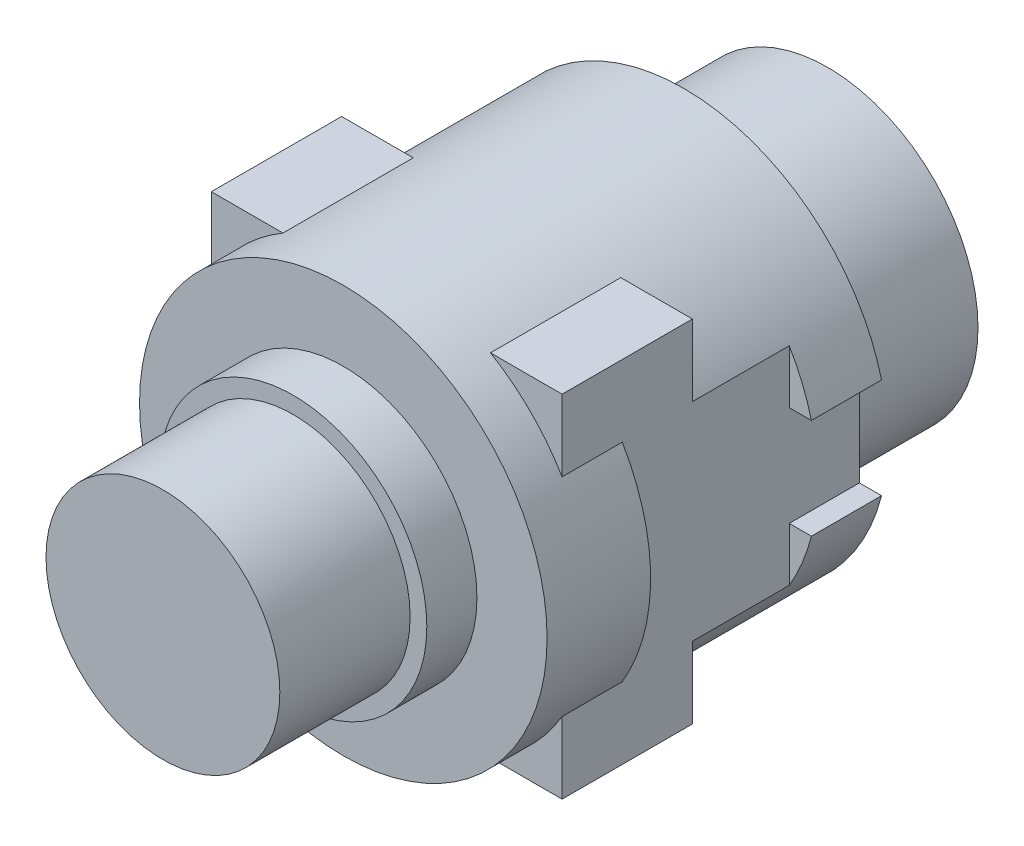
ISO-10303-21;
HEADER;
FILE_DESCRIPTION(('STEP AP214'),'2;1');
FILE_NAME('part.step','',(''),(''),'','','');
FILE_SCHEMA(('AUTOMOTIVE_DESIGN { 1 0 10303 214 1 1 1 1 }'));
ENDSEC;
DATA;
#1=APPLICATION_CONTEXT('core data for automotive mechanical design processes');
#2=APPLICATION_PROTOCOL_DEFINITION('international standard','automotive_design',2000,#1);
#3=PRODUCT_CONTEXT('',#1,'mechanical');
#4=PRODUCT('Part','Part','',(#3));
#5=PRODUCT_RELATED_PRODUCT_CATEGORY('part','',(#4));
#6=PRODUCT_DEFINITION_FORMATION('','',#4);
#7=PRODUCT_DEFINITION_CONTEXT('part definition',#1,'design');
#8=PRODUCT_DEFINITION('design','',#6,#7);
#9=PRODUCT_DEFINITION_SHAPE('','',#8);
#10=(LENGTH_UNIT() NAMED_UNIT(*) SI_UNIT(.MILLI.,.METRE.));
#11=(NAMED_UNIT(*) PLANE_ANGLE_UNIT() SI_UNIT($,.RADIAN.));
#12=(NAMED_UNIT(*) SI_UNIT($,.STERADIAN.) SOLID_ANGLE_UNIT());
#13=UNCERTAINTY_MEASURE_WITH_UNIT(LENGTH_MEASURE(1.E-05),#10,'distance_accuracy_value','');
#14=(GEOMETRIC_REPRESENTATION_CONTEXT(3) GLOBAL_UNCERTAINTY_ASSIGNED_CONTEXT((#13)) GLOBAL_UNIT_ASSIGNED_CONTEXT((#10,
#11,#12)) REPRESENTATION_CONTEXT('',''));
#15=CARTESIAN_POINT('',(0.,0.,0.));
#16=DIRECTION('',(0.,0.,1.));
#17=DIRECTION('',(1.,0.,0.));
#18=AXIS2_PLACEMENT_3D('',#15,#16,#17);
#19=CARTESIAN_POINT('',(0.,0.,10.2));
#20=DIRECTION('',(0.,0.,-1.));
#21=DIRECTION('',(-1.,0.,0.));
#22=AXIS2_PLACEMENT_3D('',#19,#20,#21);
#23=CYLINDRICAL_SURFACE('',#22,6.1);
#24=CARTESIAN_POINT('',(0.,0.,10.2));
#25=DIRECTION('',(0.,0.,1.));
#26=DIRECTION('',(1.,0.,0.));
#27=AXIS2_PLACEMENT_3D('',#24,#25,#26);
#28=CIRCLE('',#27,6.1);
#29=CARTESIAN_POINT('',(6.1,0.,10.2));
#30=VERTEX_POINT('',#29);
#31=EDGE_CURVE('E333',#30,#30,#28,.T.);
#32=ORIENTED_EDGE('',*,*,#31,.F.);
#33=EDGE_LOOP('',(#32));
#34=FACE_BOUND('',#33,.T.);
#35=CARTESIAN_POINT('',(0.,0.,0.));
#36=DIRECTION('',(0.,0.,1.));
#37=DIRECTION('',(1.,0.,0.));
#38=AXIS2_PLACEMENT_3D('',#35,#36,#37);
#39=CIRCLE('',#38,6.1);
#40=CARTESIAN_POINT('',(5.91269819963779,1.5,0.));
#41=VERTEX_POINT('',#40);
#42=CARTESIAN_POINT('',(-5.91269819963779,1.5,0.));
#43=VERTEX_POINT('',#42);
#44=EDGE_CURVE('E337',#41,#43,#39,.T.);
#45=ORIENTED_EDGE('',*,*,#44,.T.);
#46=DIRECTION('',(0.,0.,-1.));
#47=VECTOR('',#46,1.);
#48=CARTESIAN_POINT('',(-5.91269819963779,1.5,10.2));
#49=LINE('',#48,#47);
#50=CARTESIAN_POINT('',(-5.91269819963779,1.5,2.1));
#51=VERTEX_POINT('',#50);
#52=EDGE_CURVE('E252',#43,#51,#49,.F.);
#53=ORIENTED_EDGE('',*,*,#52,.T.);
#54=CARTESIAN_POINT('',(0.,0.,2.1));
#55=DIRECTION('',(0.,0.,1.));
#56=DIRECTION('',(1.,0.,0.));
#57=AXIS2_PLACEMENT_3D('',#54,#55,#56);
#58=CIRCLE('',#57,6.1);
#59=CARTESIAN_POINT('',(-5.25,3.10604249809947,2.1));
#60=VERTEX_POINT('',#59);
#61=EDGE_CURVE('E278',#60,#51,#58,.T.);
#62=ORIENTED_EDGE('',*,*,#61,.F.);
#63=DIRECTION('',(0.,0.,-1.));
#64=VECTOR('',#63,1.);
#65=CARTESIAN_POINT('',(-5.25,3.10604249809947,7.1));
#66=LINE('',#65,#64);
#67=CARTESIAN_POINT('',(-5.25,3.10604249809947,5.));
#68=VERTEX_POINT('',#67);
#69=EDGE_CURVE('E289',#68,#60,#66,.T.);
#70=ORIENTED_EDGE('',*,*,#69,.F.);
#71=CARTESIAN_POINT('',(0.,0.,5.));
#72=DIRECTION('',(0.,0.,-1.));
#73=DIRECTION('',(-1.,0.,0.));
#74=AXIS2_PLACEMENT_3D('',#71,#72,#73);
#75=CIRCLE('',#74,6.1);
#76=CARTESIAN_POINT('',(-3.10604249809947,5.25,5.));
#77=VERTEX_POINT('',#76);
#78=EDGE_CURVE('E352',#68,#77,#75,.T.);
#79=ORIENTED_EDGE('',*,*,#78,.T.);
#80=DIRECTION('',(0.,0.,-1.));
#81=VECTOR('',#80,1.);
#82=CARTESIAN_POINT('',(-3.10604249809947,5.25,10.2));
#83=LINE('',#82,#81);
#84=CARTESIAN_POINT('',(-3.10604249809947,5.25,8.9));
#85=VERTEX_POINT('',#84);
#86=EDGE_CURVE('E366',#85,#77,#83,.T.);
#87=ORIENTED_EDGE('',*,*,#86,.F.);
#88=CARTESIAN_POINT('',(0.,0.,8.9));
#89=DIRECTION('',(0.,0.,-1.));
#90=DIRECTION('',(-1.,0.,0.));
#91=AXIS2_PLACEMENT_3D('',#88,#89,#90);
#92=CIRCLE('',#91,6.1);
#93=CARTESIAN_POINT('',(-5.25,3.10604249809947,8.9));
#94=VERTEX_POINT('',#93);
#95=EDGE_CURVE('E343',#94,#85,#92,.T.);
#96=ORIENTED_EDGE('',*,*,#95,.F.);
#97=DIRECTION('',(0.,0.,-1.));
#98=VECTOR('',#97,1.);
#99=CARTESIAN_POINT('',(-5.25,3.10604249809947,10.2));
#100=LINE('',#99,#98);
#101=CARTESIAN_POINT('',(-5.25,3.10604249809947,7.1));
#102=VERTEX_POINT('',#101);
#103=EDGE_CURVE('E368',#102,#94,#100,.F.);
#104=ORIENTED_EDGE('',*,*,#103,.F.);
#105=CARTESIAN_POINT('',(0.,0.,7.1));
#106=DIRECTION('',(0.,0.,1.));
#107=DIRECTION('',(1.,0.,0.));
#108=AXIS2_PLACEMENT_3D('',#105,#106,#107);
#109=CIRCLE('',#108,6.1);
#110=CARTESIAN_POINT('',(-5.25,-3.10604249809947,7.1));
#111=VERTEX_POINT('',#110);
#112=EDGE_CURVE('E277',#102,#111,#109,.T.);
#113=ORIENTED_EDGE('',*,*,#112,.T.);
#114=DIRECTION('',(0.,0.,-1.));
#115=VECTOR('',#114,1.);
#116=CARTESIAN_POINT('',(-5.25,-3.10604249809947,10.2));
#117=LINE('',#116,#115);
#118=CARTESIAN_POINT('',(-5.25,-3.10604249809947,8.9));
#119=VERTEX_POINT('',#118);
#120=EDGE_CURVE('E346',#119,#111,#117,.T.);
#121=ORIENTED_EDGE('',*,*,#120,.F.);
#122=CARTESIAN_POINT('',(-3.10604249809947,-5.25,8.9));
#123=VERTEX_POINT('',#122);
#124=EDGE_CURVE('E336',#123,#119,#92,.T.);
#125=ORIENTED_EDGE('',*,*,#124,.F.);
#126=DIRECTION('',(0.,0.,-1.));
#127=VECTOR('',#126,1.);
#128=CARTESIAN_POINT('',(-3.10604249809947,-5.25,10.2));
#129=LINE('',#128,#127);
#130=CARTESIAN_POINT('',(-3.10604249809947,-5.25,5.));
#131=VERTEX_POINT('',#130);
#132=EDGE_CURVE('E342',#123,#131,#129,.T.);
#133=ORIENTED_EDGE('',*,*,#132,.T.);
#134=CARTESIAN_POINT('',(-5.25,-3.10604249809947,5.));
#135=VERTEX_POINT('',#134);
#136=EDGE_CURVE('E349',#131,#135,#75,.T.);
#137=ORIENTED_EDGE('',*,*,#136,.T.);
#138=DIRECTION('',(0.,0.,-1.));
#139=VECTOR('',#138,1.);
#140=CARTESIAN_POINT('',(-5.25,-3.10604249809947,7.1));
#141=LINE('',#140,#139);
#142=CARTESIAN_POINT('',(-5.25,-3.10604249809947,2.1));
#143=VERTEX_POINT('',#142);
#144=EDGE_CURVE('E281',#135,#143,#141,.T.);
#145=ORIENTED_EDGE('',*,*,#144,.T.);
#146=CARTESIAN_POINT('',(-5.91269819963779,-1.5,2.1));
#147=VERTEX_POINT('',#146);
#148=EDGE_CURVE('E284',#147,#143,#58,.T.);
#149=ORIENTED_EDGE('',*,*,#148,.F.);
#150=DIRECTION('',(0.,0.,-1.));
#151=VECTOR('',#150,1.);
#152=CARTESIAN_POINT('',(-5.91269819963779,-1.5,10.2));
#153=LINE('',#152,#151);
#154=CARTESIAN_POINT('',(-5.91269819963779,-1.5,0.));
#155=VERTEX_POINT('',#154);
#156=EDGE_CURVE('E54',#147,#155,#153,.T.);
#157=ORIENTED_EDGE('',*,*,#156,.T.);
#158=CARTESIAN_POINT('',(5.91269819963779,-1.5,0.));
#159=VERTEX_POINT('',#158);
#160=EDGE_CURVE('E222',#155,#159,#39,.T.);
#161=ORIENTED_EDGE('',*,*,#160,.T.);
#162=DIRECTION('',(0.,0.,1.));
#163=VECTOR('',#162,1.);
#164=CARTESIAN_POINT('',(5.91269819963779,-1.5,0.));
#165=LINE('',#164,#163);
#166=CARTESIAN_POINT('',(5.91269819963779,-1.5,2.1));
#167=VERTEX_POINT('',#166);
#168=EDGE_CURVE('E247',#159,#167,#165,.T.);
#169=ORIENTED_EDGE('',*,*,#168,.T.);
#170=CARTESIAN_POINT('',(0.,0.,2.1));
#171=DIRECTION('',(0.,0.,1.));
#172=DIRECTION('',(1.,0.,0.));
#173=AXIS2_PLACEMENT_3D('',#170,#171,#172);
#174=CIRCLE('',#173,6.1);
#175=CARTESIAN_POINT('',(5.25,-3.10604249809947,2.1));
#176=VERTEX_POINT('',#175);
#177=EDGE_CURVE('E259',#176,#167,#174,.T.);
#178=ORIENTED_EDGE('',*,*,#177,.F.);
#179=DIRECTION('',(0.,0.,-1.));
#180=VECTOR('',#179,1.);
#181=CARTESIAN_POINT('',(5.25,-3.10604249809947,7.1));
#182=LINE('',#181,#180);
#183=CARTESIAN_POINT('',(5.25,-3.10604249809947,5.));
#184=VERTEX_POINT('',#183);
#185=EDGE_CURVE('E272',#184,#176,#182,.T.);
#186=ORIENTED_EDGE('',*,*,#185,.F.);
#187=CARTESIAN_POINT('',(3.10604249809947,-5.25,5.));
#188=VERTEX_POINT('',#187);
#189=EDGE_CURVE('E353',#184,#188,#75,.T.);
#190=ORIENTED_EDGE('',*,*,#189,.T.);
#191=DIRECTION('',(0.,0.,-1.));
#192=VECTOR('',#191,1.);
#193=CARTESIAN_POINT('',(3.10604249809947,-5.25,10.2));
#194=LINE('',#193,#192);
#195=CARTESIAN_POINT('',(3.10604249809947,-5.25,8.9));
#196=VERTEX_POINT('',#195);
#197=EDGE_CURVE('E354',#188,#196,#194,.F.);
#198=ORIENTED_EDGE('',*,*,#197,.T.);
#199=CARTESIAN_POINT('',(5.25,-3.10604249809947,8.9));
#200=VERTEX_POINT('',#199);
#201=EDGE_CURVE('E344',#200,#196,#92,.T.);
#202=ORIENTED_EDGE('',*,*,#201,.F.);
#203=DIRECTION('',(0.,0.,-1.));
#204=VECTOR('',#203,1.);
#205=CARTESIAN_POINT('',(5.25,-3.10604249809947,10.2));
#206=LINE('',#205,#204);
#207=CARTESIAN_POINT('',(5.25,-3.10604249809947,7.1));
#208=VERTEX_POINT('',#207);
#209=EDGE_CURVE('E356',#200,#208,#206,.T.);
#210=ORIENTED_EDGE('',*,*,#209,.T.);
#211=CARTESIAN_POINT('',(0.,0.,7.1));
#212=DIRECTION('',(0.,0.,1.));
#213=DIRECTION('',(1.,0.,0.));
#214=AXIS2_PLACEMENT_3D('',#211,#212,#213);
#215=CIRCLE('',#214,6.1);
#216=CARTESIAN_POINT('',(5.25,3.10604249809947,7.1));
#217=VERTEX_POINT('',#216);
#218=EDGE_CURVE('E258',#208,#217,#215,.T.);
#219=ORIENTED_EDGE('',*,*,#218,.T.);
#220=DIRECTION('',(0.,0.,-1.));
#221=VECTOR('',#220,1.);
#222=CARTESIAN_POINT('',(5.25,3.10604249809947,10.2));
#223=LINE('',#222,#221);
#224=CARTESIAN_POINT('',(5.25,3.10604249809947,8.9));
#225=VERTEX_POINT('',#224);
#226=EDGE_CURVE('E359',#217,#225,#223,.F.);
#227=ORIENTED_EDGE('',*,*,#226,.T.);
#228=CARTESIAN_POINT('',(3.10604249809947,5.25,8.9));
#229=VERTEX_POINT('',#228);
#230=EDGE_CURVE('E362',#229,#225,#92,.T.);
#231=ORIENTED_EDGE('',*,*,#230,.F.);
#232=DIRECTION('',(0.,0.,-1.));
#233=VECTOR('',#232,1.);
#234=CARTESIAN_POINT('',(3.10604249809947,5.25,10.2));
#235=LINE('',#234,#233);
#236=CARTESIAN_POINT('',(3.10604249809947,5.25,5.));
#237=VERTEX_POINT('',#236);
#238=EDGE_CURVE('E361',#237,#229,#235,.F.);
#239=ORIENTED_EDGE('',*,*,#238,.F.);
#240=CARTESIAN_POINT('',(5.25,3.10604249809947,5.));
#241=VERTEX_POINT('',#240);
#242=EDGE_CURVE('E365',#237,#241,#75,.T.);
#243=ORIENTED_EDGE('',*,*,#242,.T.);
#244=DIRECTION('',(0.,0.,-1.));
#245=VECTOR('',#244,1.);
#246=CARTESIAN_POINT('',(5.25,3.10604249809947,7.1));
#247=LINE('',#246,#245);
#248=CARTESIAN_POINT('',(5.25,3.10604249809947,2.1));
#249=VERTEX_POINT('',#248);
#250=EDGE_CURVE('E262',#241,#249,#247,.T.);
#251=ORIENTED_EDGE('',*,*,#250,.T.);
#252=CARTESIAN_POINT('',(5.91269819963779,1.5,2.1));
#253=VERTEX_POINT('',#252);
#254=EDGE_CURVE('E266',#253,#249,#174,.T.);
#255=ORIENTED_EDGE('',*,*,#254,.F.);
#256=DIRECTION('',(0.,0.,1.));
#257=VECTOR('',#256,1.);
#258=CARTESIAN_POINT('',(5.91269819963779,1.5,0.));
#259=LINE('',#258,#257);
#260=EDGE_CURVE('E245',#41,#253,#259,.T.);
#261=ORIENTED_EDGE('',*,*,#260,.F.);
#262=EDGE_LOOP('',(#45,#53,#62,#70,#79,#87,#96,#104,#113,#121,#125,#133,#137,#145,#149,#157,
#161,#169,#178,#186,#190,#198,#202,#210,#219,#227,#231,#239,#243,#251,#255,#261));
#263=FACE_BOUND('',#262,.T.);
#264=ADVANCED_FACE('F39',(#34,#263),#23,.T.);
#265=CARTESIAN_POINT('',(0.,0.,0.));
#266=DIRECTION('',(0.,0.,1.));
#267=DIRECTION('',(1.,0.,0.));
#268=AXIS2_PLACEMENT_3D('',#265,#266,#267);
#269=PLANE('',#268);
#270=CARTESIAN_POINT('',(0.,0.,0.));
#271=DIRECTION('',(0.,0.,-1.));
#272=DIRECTION('',(-1.,0.,0.));
#273=AXIS2_PLACEMENT_3D('',#270,#271,#272);
#274=CIRCLE('',#273,4.5);
#275=CARTESIAN_POINT('',(4.5,0.,0.));
#276=VERTEX_POINT('',#275);
#277=EDGE_CURVE('E11',#276,#276,#274,.T.);
#278=ORIENTED_EDGE('',*,*,#277,.F.);
#279=EDGE_LOOP('',(#278));
#280=FACE_BOUND('',#279,.T.);
#281=DIRECTION('',(0.,-1.,0.));
#282=VECTOR('',#281,1.);
#283=CARTESIAN_POINT('',(-5.25,0.,0.));
#284=LINE('',#283,#282);
#285=CARTESIAN_POINT('',(-5.25,1.5,0.));
#286=VERTEX_POINT('',#285);
#287=CARTESIAN_POINT('',(-5.25,-1.5,0.));
#288=VERTEX_POINT('',#287);
#289=EDGE_CURVE('E200',#286,#288,#284,.T.);
#290=ORIENTED_EDGE('',*,*,#289,.F.);
#291=DIRECTION('',(-1.,0.,0.));
#292=VECTOR('',#291,1.);
#293=CARTESIAN_POINT('',(0.,1.5,0.));
#294=LINE('',#293,#292);
#295=EDGE_CURVE('E213',#286,#43,#294,.T.);
#296=ORIENTED_EDGE('',*,*,#295,.T.);
#297=ORIENTED_EDGE('',*,*,#44,.F.);
#298=DIRECTION('',(1.,0.,0.));
#299=VECTOR('',#298,1.);
#300=CARTESIAN_POINT('',(0.,1.5,0.));
#301=LINE('',#300,#299);
#302=CARTESIAN_POINT('',(5.25,1.5,0.));
#303=VERTEX_POINT('',#302);
#304=EDGE_CURVE('E237',#303,#41,#301,.T.);
#305=ORIENTED_EDGE('',*,*,#304,.F.);
#306=DIRECTION('',(0.,-1.,0.));
#307=VECTOR('',#306,1.);
#308=CARTESIAN_POINT('',(5.25,0.,0.));
#309=LINE('',#308,#307);
#310=CARTESIAN_POINT('',(5.25,-1.5,0.));
#311=VERTEX_POINT('',#310);
#312=EDGE_CURVE('E231',#303,#311,#309,.T.);
#313=ORIENTED_EDGE('',*,*,#312,.T.);
#314=DIRECTION('',(1.,0.,0.));
#315=VECTOR('',#314,1.);
#316=CARTESIAN_POINT('',(0.,-1.5,0.));
#317=LINE('',#316,#315);
#318=EDGE_CURVE('E234',#311,#159,#317,.T.);
#319=ORIENTED_EDGE('',*,*,#318,.T.);
#320=ORIENTED_EDGE('',*,*,#160,.F.);
#321=DIRECTION('',(1.,0.,0.));
#322=VECTOR('',#321,1.);
#323=CARTESIAN_POINT('',(0.,-1.5,0.));
#324=LINE('',#323,#322);
#325=EDGE_CURVE('E214',#155,#288,#324,.T.);
#326=ORIENTED_EDGE('',*,*,#325,.T.);
#327=EDGE_LOOP('',(#290,#296,#297,#305,#313,#319,#320,#326));
#328=FACE_BOUND('',#327,.T.);
#329=ADVANCED_FACE('F219',(#280,#328),#269,.F.);
#330=CARTESIAN_POINT('',(0.,0.,2.1));
#331=DIRECTION('',(0.,0.,1.));
#332=DIRECTION('',(1.,0.,0.));
#333=AXIS2_PLACEMENT_3D('',#330,#331,#332);
#334=PLANE('',#333);
#335=DIRECTION('',(-1.,0.,0.));
#336=VECTOR('',#335,1.);
#337=CARTESIAN_POINT('',(0.,1.5,2.1));
#338=LINE('',#337,#336);
#339=CARTESIAN_POINT('',(-5.25,1.5,2.1));
#340=VERTEX_POINT('',#339);
#341=EDGE_CURVE('E223',#340,#51,#338,.T.);
#342=ORIENTED_EDGE('',*,*,#341,.F.);
#343=DIRECTION('',(0.,1.,0.));
#344=VECTOR('',#343,1.);
#345=CARTESIAN_POINT('',(-5.25,0.,2.1));
#346=LINE('',#345,#344);
#347=EDGE_CURVE('E255',#340,#60,#346,.T.);
#348=ORIENTED_EDGE('',*,*,#347,.T.);
#349=ORIENTED_EDGE('',*,*,#61,.T.);
#350=EDGE_LOOP('',(#342,#348,#349));
#351=FACE_BOUND('',#350,.T.);
#352=ADVANCED_FACE('F424',(#351),#334,.T.);
#353=CARTESIAN_POINT('',(0.,0.,2.1));
#354=DIRECTION('',(0.,0.,1.));
#355=DIRECTION('',(1.,0.,0.));
#356=AXIS2_PLACEMENT_3D('',#353,#354,#355);
#357=PLANE('',#356);
#358=DIRECTION('',(0.,1.,0.));
#359=VECTOR('',#358,1.);
#360=CARTESIAN_POINT('',(5.25,0.,2.1));
#361=LINE('',#360,#359);
#362=CARTESIAN_POINT('',(5.25,1.5,2.1));
#363=VERTEX_POINT('',#362);
#364=EDGE_CURVE('E267',#363,#249,#361,.T.);
#365=ORIENTED_EDGE('',*,*,#364,.F.);
#366=DIRECTION('',(1.,0.,0.));
#367=VECTOR('',#366,1.);
#368=CARTESIAN_POINT('',(0.,1.5,2.1));
#369=LINE('',#368,#367);
#370=EDGE_CURVE('E235',#363,#253,#369,.T.);
#371=ORIENTED_EDGE('',*,*,#370,.T.);
#372=ORIENTED_EDGE('',*,*,#254,.T.);
#373=EDGE_LOOP('',(#365,#371,#372));
#374=FACE_BOUND('',#373,.T.);
#375=ADVANCED_FACE('F414',(#374),#357,.T.);
#376=CARTESIAN_POINT('',(0.,0.,10.2));
#377=DIRECTION('',(0.,0.,1.));
#378=DIRECTION('',(1.,0.,0.));
#379=AXIS2_PLACEMENT_3D('',#376,#377,#378);
#380=PLANE('',#379);
#381=CARTESIAN_POINT('',(0.,0.,10.2));
#382=DIRECTION('',(0.,0.,1.));
#383=DIRECTION('',(1.,0.,0.));
#384=AXIS2_PLACEMENT_3D('',#381,#382,#383);
#385=CIRCLE('',#384,4.);
#386=CARTESIAN_POINT('',(4.,0.,10.2));
#387=VERTEX_POINT('',#386);
#388=EDGE_CURVE('E850',#387,#387,#385,.T.);
#389=ORIENTED_EDGE('',*,*,#388,.F.);
#390=EDGE_LOOP('',(#389));
#391=FACE_BOUND('',#390,.T.);
#392=ORIENTED_EDGE('',*,*,#31,.T.);
#393=EDGE_LOOP('',(#392));
#394=FACE_BOUND('',#393,.T.);
#395=ADVANCED_FACE('F477',(#391,#394),#380,.T.);
#396=CARTESIAN_POINT('',(0.,0.,8.9));
#397=DIRECTION('',(0.,0.,-1.));
#398=DIRECTION('',(-1.,0.,0.));
#399=AXIS2_PLACEMENT_3D('',#396,#397,#398);
#400=PLANE('',#399);
#401=DIRECTION('',(1.,0.,0.));
#402=VECTOR('',#401,1.);
#403=CARTESIAN_POINT('',(-5.25,-5.25,8.9));
#404=LINE('',#403,#402);
#405=CARTESIAN_POINT('',(-5.25,-5.25,8.9));
#406=VERTEX_POINT('',#405);
#407=EDGE_CURVE('E320',#406,#123,#404,.T.);
#408=ORIENTED_EDGE('',*,*,#407,.T.);
#409=ORIENTED_EDGE('',*,*,#124,.T.);
#410=DIRECTION('',(0.,1.,0.));
#411=VECTOR('',#410,1.);
#412=CARTESIAN_POINT('',(-5.25,-5.25,8.9));
#413=LINE('',#412,#411);
#414=EDGE_CURVE('E309',#406,#119,#413,.T.);
#415=ORIENTED_EDGE('',*,*,#414,.F.);
#416=EDGE_LOOP('',(#408,#409,#415));
#417=FACE_BOUND('',#416,.T.);
#418=ADVANCED_FACE('F442',(#417),#400,.F.);
#419=CARTESIAN_POINT('',(0.,0.,5.));
#420=DIRECTION('',(0.,0.,-1.));
#421=DIRECTION('',(-1.,0.,0.));
#422=AXIS2_PLACEMENT_3D('',#419,#420,#421);
#423=PLANE('',#422);
#424=ORIENTED_EDGE('',*,*,#136,.F.);
#425=DIRECTION('',(1.,0.,0.));
#426=VECTOR('',#425,1.);
#427=CARTESIAN_POINT('',(-5.25,-5.25,5.));
#428=LINE('',#427,#426);
#429=CARTESIAN_POINT('',(-5.25,-5.25,5.));
#430=VERTEX_POINT('',#429);
#431=EDGE_CURVE('E305',#430,#131,#428,.T.);
#432=ORIENTED_EDGE('',*,*,#431,.F.);
#433=DIRECTION('',(0.,1.,0.));
#434=VECTOR('',#433,1.);
#435=CARTESIAN_POINT('',(-5.25,-5.25,5.));
#436=LINE('',#435,#434);
#437=EDGE_CURVE('E292',#430,#135,#436,.T.);
#438=ORIENTED_EDGE('',*,*,#437,.T.);
#439=EDGE_LOOP('',(#424,#432,#438));
#440=FACE_BOUND('',#439,.T.);
#441=ADVANCED_FACE('F449',(#440),#423,.T.);
#442=CARTESIAN_POINT('',(-5.25,-5.25,5.));
#443=DIRECTION('',(0.,-1.,0.));
#444=DIRECTION('',(0.,0.,-1.));
#445=AXIS2_PLACEMENT_3D('',#442,#443,#444);
#446=PLANE('',#445);
#447=ORIENTED_EDGE('',*,*,#132,.F.);
#448=ORIENTED_EDGE('',*,*,#407,.F.);
#449=DIRECTION('',(0.,0.,1.));
#450=VECTOR('',#449,1.);
#451=CARTESIAN_POINT('',(-5.25,-5.25,5.));
#452=LINE('',#451,#450);
#453=EDGE_CURVE('E308',#430,#406,#452,.T.);
#454=ORIENTED_EDGE('',*,*,#453,.F.);
#455=ORIENTED_EDGE('',*,*,#431,.T.);
#456=EDGE_LOOP('',(#447,#448,#454,#455));
#457=FACE_BOUND('',#456,.T.);
#458=ADVANCED_FACE('F445',(#457),#446,.T.);
#459=CARTESIAN_POINT('',(-5.25,-5.25,5.));
#460=DIRECTION('',(1.,0.,0.));
#461=DIRECTION('',(0.,0.,-1.));
#462=AXIS2_PLACEMENT_3D('',#459,#460,#461);
#463=PLANE('',#462);
#464=ORIENTED_EDGE('',*,*,#414,.T.);
#465=ORIENTED_EDGE('',*,*,#120,.T.);
#466=DIRECTION('',(0.,1.,0.));
#467=VECTOR('',#466,1.);
#468=CARTESIAN_POINT('',(-5.25,0.,7.1));
#469=LINE('',#468,#467);
#470=EDGE_CURVE('E275',#111,#102,#469,.T.);
#471=ORIENTED_EDGE('',*,*,#470,.T.);
#472=ORIENTED_EDGE('',*,*,#103,.T.);
#473=CARTESIAN_POINT('',(-5.25,5.25,8.9));
#474=VERTEX_POINT('',#473);
#475=EDGE_CURVE('E274',#94,#474,#413,.T.);
#476=ORIENTED_EDGE('',*,*,#475,.T.);
#477=DIRECTION('',(0.,0.,1.));
#478=VECTOR('',#477,1.);
#479=CARTESIAN_POINT('',(-5.25,5.25,5.));
#480=LINE('',#479,#478);
#481=CARTESIAN_POINT('',(-5.25,5.25,5.));
#482=VERTEX_POINT('',#481);
#483=EDGE_CURVE('E330',#482,#474,#480,.T.);
#484=ORIENTED_EDGE('',*,*,#483,.F.);
#485=EDGE_CURVE('E296',#68,#482,#436,.T.);
#486=ORIENTED_EDGE('',*,*,#485,.F.);
#487=ORIENTED_EDGE('',*,*,#69,.T.);
#488=ORIENTED_EDGE('',*,*,#347,.F.);
#489=DIRECTION('',(0.,0.,1.));
#490=VECTOR('',#489,1.);
#491=CARTESIAN_POINT('',(-5.25,1.5,0.));
#492=LINE('',#491,#490);
#493=EDGE_CURVE('E208',#286,#340,#492,.T.);
#494=ORIENTED_EDGE('',*,*,#493,.F.);
#495=ORIENTED_EDGE('',*,*,#289,.T.);
#496=DIRECTION('',(0.,0.,1.));
#497=VECTOR('',#496,1.);
#498=CARTESIAN_POINT('',(-5.25,-1.5,0.));
#499=LINE('',#498,#497);
#500=CARTESIAN_POINT('',(-5.25,-1.5,2.1));
#501=VERTEX_POINT('',#500);
#502=EDGE_CURVE('E205',#288,#501,#499,.T.);
#503=ORIENTED_EDGE('',*,*,#502,.T.);
#504=EDGE_CURVE('E282',#143,#501,#346,.T.);
#505=ORIENTED_EDGE('',*,*,#504,.F.);
#506=ORIENTED_EDGE('',*,*,#144,.F.);
#507=ORIENTED_EDGE('',*,*,#437,.F.);
#508=ORIENTED_EDGE('',*,*,#453,.T.);
#509=EDGE_LOOP('',(#464,#465,#471,#472,#476,#484,#486,#487,#488,#494,#495,#503,#505,#506,#507,#508));
#510=FACE_BOUND('',#509,.T.);
#511=ADVANCED_FACE('F203',(#510),#463,.F.);
#512=DIRECTION('',(0.,1.,0.));
#513=VECTOR('',#512,1.);
#514=CARTESIAN_POINT('',(5.25,-5.25,8.9));
#515=LINE('',#514,#513);
#516=CARTESIAN_POINT('',(5.25,-5.25,8.9));
#517=VERTEX_POINT('',#516);
#518=EDGE_CURVE('E316',#517,#200,#515,.T.);
#519=ORIENTED_EDGE('',*,*,#518,.T.);
#520=ORIENTED_EDGE('',*,*,#201,.T.);
#521=EDGE_CURVE('E319',#196,#517,#404,.T.);
#522=ORIENTED_EDGE('',*,*,#521,.T.);
#523=EDGE_LOOP('',(#519,#520,#522));
#524=FACE_BOUND('',#523,.T.);
#525=ADVANCED_FACE('F387',(#524),#400,.F.);
#526=ORIENTED_EDGE('',*,*,#189,.F.);
#527=DIRECTION('',(0.,1.,0.));
#528=VECTOR('',#527,1.);
#529=CARTESIAN_POINT('',(5.25,-5.25,5.));
#530=LINE('',#529,#528);
#531=CARTESIAN_POINT('',(5.25,-5.25,5.));
#532=VERTEX_POINT('',#531);
#533=EDGE_CURVE('E301',#532,#184,#530,.T.);
#534=ORIENTED_EDGE('',*,*,#533,.F.);
#535=EDGE_CURVE('E304',#188,#532,#428,.T.);
#536=ORIENTED_EDGE('',*,*,#535,.F.);
#537=EDGE_LOOP('',(#526,#534,#536));
#538=FACE_BOUND('',#537,.T.);
#539=ADVANCED_FACE('F499',(#538),#423,.T.);
#540=ORIENTED_EDGE('',*,*,#197,.F.);
#541=ORIENTED_EDGE('',*,*,#535,.T.);
#542=DIRECTION('',(0.,0.,1.));
#543=VECTOR('',#542,1.);
#544=CARTESIAN_POINT('',(5.25,-5.25,5.));
#545=LINE('',#544,#543);
#546=EDGE_CURVE('E324',#532,#517,#545,.T.);
#547=ORIENTED_EDGE('',*,*,#546,.T.);
#548=ORIENTED_EDGE('',*,*,#521,.F.);
#549=EDGE_LOOP('',(#540,#541,#547,#548));
#550=FACE_BOUND('',#549,.T.);
#551=ADVANCED_FACE('F391',(#550),#446,.T.);
#552=CARTESIAN_POINT('',(5.25,-5.25,5.));
#553=DIRECTION('',(1.,0.,0.));
#554=DIRECTION('',(0.,0.,-1.));
#555=AXIS2_PLACEMENT_3D('',#552,#553,#554);
#556=PLANE('',#555);
#557=ORIENTED_EDGE('',*,*,#209,.F.);
#558=ORIENTED_EDGE('',*,*,#518,.F.);
#559=ORIENTED_EDGE('',*,*,#546,.F.);
#560=ORIENTED_EDGE('',*,*,#533,.T.);
#561=ORIENTED_EDGE('',*,*,#185,.T.);
#562=CARTESIAN_POINT('',(5.25,-1.5,2.1));
#563=VERTEX_POINT('',#562);
#564=EDGE_CURVE('E263',#176,#563,#361,.T.);
#565=ORIENTED_EDGE('',*,*,#564,.T.);
#566=DIRECTION('',(0.,0.,1.));
#567=VECTOR('',#566,1.);
#568=CARTESIAN_POINT('',(5.25,-1.5,0.));
#569=LINE('',#568,#567);
#570=EDGE_CURVE('E62',#311,#563,#569,.T.);
#571=ORIENTED_EDGE('',*,*,#570,.F.);
#572=ORIENTED_EDGE('',*,*,#312,.F.);
#573=DIRECTION('',(0.,0.,1.));
#574=VECTOR('',#573,1.);
#575=CARTESIAN_POINT('',(5.25,1.5,0.));
#576=LINE('',#575,#574);
#577=EDGE_CURVE('E225',#303,#363,#576,.T.);
#578=ORIENTED_EDGE('',*,*,#577,.T.);
#579=ORIENTED_EDGE('',*,*,#364,.T.);
#580=ORIENTED_EDGE('',*,*,#250,.F.);
#581=CARTESIAN_POINT('',(5.25,5.25,5.));
#582=VERTEX_POINT('',#581);
#583=EDGE_CURVE('E300',#241,#582,#530,.T.);
#584=ORIENTED_EDGE('',*,*,#583,.T.);
#585=DIRECTION('',(0.,0.,1.));
#586=VECTOR('',#585,1.);
#587=CARTESIAN_POINT('',(5.25,5.25,5.));
#588=LINE('',#587,#586);
#589=CARTESIAN_POINT('',(5.25,5.25,8.9));
#590=VERTEX_POINT('',#589);
#591=EDGE_CURVE('E327',#582,#590,#588,.T.);
#592=ORIENTED_EDGE('',*,*,#591,.T.);
#593=EDGE_CURVE('E315',#225,#590,#515,.T.);
#594=ORIENTED_EDGE('',*,*,#593,.F.);
#595=ORIENTED_EDGE('',*,*,#226,.F.);
#596=DIRECTION('',(0.,1.,0.));
#597=VECTOR('',#596,1.);
#598=CARTESIAN_POINT('',(5.25,0.,7.1));
#599=LINE('',#598,#597);
#600=EDGE_CURVE('E256',#208,#217,#599,.T.);
#601=ORIENTED_EDGE('',*,*,#600,.F.);
#602=EDGE_LOOP('',(#557,#558,#559,#560,#561,#565,#571,#572,#578,#579,#580,#584,#592,#594,#595,#601));
#603=FACE_BOUND('',#602,.T.);
#604=ADVANCED_FACE('F396',(#603),#556,.T.);
#605=DIRECTION('',(1.,0.,0.));
#606=VECTOR('',#605,1.);
#607=CARTESIAN_POINT('',(-5.25,5.25,8.9));
#608=LINE('',#607,#606);
#609=EDGE_CURVE('E311',#229,#590,#608,.T.);
#610=ORIENTED_EDGE('',*,*,#609,.F.);
#611=ORIENTED_EDGE('',*,*,#230,.T.);
#612=ORIENTED_EDGE('',*,*,#593,.T.);
#613=EDGE_LOOP('',(#610,#611,#612));
#614=FACE_BOUND('',#613,.T.);
#615=ADVANCED_FACE('F401',(#614),#400,.F.);
#616=ORIENTED_EDGE('',*,*,#242,.F.);
#617=DIRECTION('',(1.,0.,0.));
#618=VECTOR('',#617,1.);
#619=CARTESIAN_POINT('',(-5.25,5.25,5.));
#620=LINE('',#619,#618);
#621=EDGE_CURVE('E295',#237,#582,#620,.T.);
#622=ORIENTED_EDGE('',*,*,#621,.T.);
#623=ORIENTED_EDGE('',*,*,#583,.F.);
#624=EDGE_LOOP('',(#616,#622,#623));
#625=FACE_BOUND('',#624,.T.);
#626=ADVANCED_FACE('F407',(#625),#423,.T.);
#627=CARTESIAN_POINT('',(-5.25,5.25,5.));
#628=DIRECTION('',(0.,-1.,0.));
#629=DIRECTION('',(0.,0.,-1.));
#630=AXIS2_PLACEMENT_3D('',#627,#628,#629);
#631=PLANE('',#630);
#632=ORIENTED_EDGE('',*,*,#621,.F.);
#633=ORIENTED_EDGE('',*,*,#238,.T.);
#634=ORIENTED_EDGE('',*,*,#609,.T.);
#635=ORIENTED_EDGE('',*,*,#591,.F.);
#636=EDGE_LOOP('',(#632,#633,#634,#635));
#637=FACE_BOUND('',#636,.T.);
#638=ADVANCED_FACE('F404',(#637),#631,.F.);
#639=EDGE_CURVE('E312',#474,#85,#608,.T.);
#640=ORIENTED_EDGE('',*,*,#639,.T.);
#641=ORIENTED_EDGE('',*,*,#86,.T.);
#642=EDGE_CURVE('E297',#482,#77,#620,.T.);
#643=ORIENTED_EDGE('',*,*,#642,.F.);
#644=ORIENTED_EDGE('',*,*,#483,.T.);
#645=EDGE_LOOP('',(#640,#641,#643,#644));
#646=FACE_BOUND('',#645,.T.);
#647=ADVANCED_FACE('F431',(#646),#631,.F.);
#648=ORIENTED_EDGE('',*,*,#78,.F.);
#649=ORIENTED_EDGE('',*,*,#485,.T.);
#650=ORIENTED_EDGE('',*,*,#642,.T.);
#651=EDGE_LOOP('',(#648,#649,#650));
#652=FACE_BOUND('',#651,.T.);
#653=ADVANCED_FACE('F428',(#652),#423,.T.);
#654=ORIENTED_EDGE('',*,*,#475,.F.);
#655=ORIENTED_EDGE('',*,*,#95,.T.);
#656=ORIENTED_EDGE('',*,*,#639,.F.);
#657=EDGE_LOOP('',(#654,#655,#656));
#658=FACE_BOUND('',#657,.T.);
#659=ADVANCED_FACE('F435',(#658),#400,.F.);
#660=CARTESIAN_POINT('',(0.,0.,7.1));
#661=DIRECTION('',(0.,0.,1.));
#662=DIRECTION('',(1.,0.,0.));
#663=AXIS2_PLACEMENT_3D('',#660,#661,#662);
#664=PLANE('',#663);
#665=ORIENTED_EDGE('',*,*,#470,.F.);
#666=ORIENTED_EDGE('',*,*,#112,.F.);
#667=EDGE_LOOP('',(#665,#666));
#668=FACE_BOUND('',#667,.T.);
#669=ADVANCED_FACE('F455',(#668),#664,.F.);
#670=DIRECTION('',(1.,0.,0.));
#671=VECTOR('',#670,1.);
#672=CARTESIAN_POINT('',(0.,-1.5,2.1));
#673=LINE('',#672,#671);
#674=EDGE_CURVE('E42',#147,#501,#673,.T.);
#675=ORIENTED_EDGE('',*,*,#674,.F.);
#676=ORIENTED_EDGE('',*,*,#148,.T.);
#677=ORIENTED_EDGE('',*,*,#504,.T.);
#678=EDGE_LOOP('',(#675,#676,#677));
#679=FACE_BOUND('',#678,.T.);
#680=ADVANCED_FACE('F452',(#679),#334,.T.);
#681=CARTESIAN_POINT('',(0.,0.,7.1));
#682=DIRECTION('',(0.,0.,1.));
#683=DIRECTION('',(1.,0.,0.));
#684=AXIS2_PLACEMENT_3D('',#681,#682,#683);
#685=PLANE('',#684);
#686=ORIENTED_EDGE('',*,*,#600,.T.);
#687=ORIENTED_EDGE('',*,*,#218,.F.);
#688=EDGE_LOOP('',(#686,#687));
#689=FACE_BOUND('',#688,.T.);
#690=ADVANCED_FACE('F454',(#689),#685,.F.);
#691=DIRECTION('',(1.,0.,0.));
#692=VECTOR('',#691,1.);
#693=CARTESIAN_POINT('',(0.,-1.5,2.1));
#694=LINE('',#693,#692);
#695=EDGE_CURVE('E239',#563,#167,#694,.T.);
#696=ORIENTED_EDGE('',*,*,#695,.F.);
#697=ORIENTED_EDGE('',*,*,#564,.F.);
#698=ORIENTED_EDGE('',*,*,#177,.T.);
#699=EDGE_LOOP('',(#696,#697,#698));
#700=FACE_BOUND('',#699,.T.);
#701=ADVANCED_FACE('F462',(#700),#357,.T.);
#702=CARTESIAN_POINT('',(0.,1.5,0.));
#703=DIRECTION('',(0.,-1.,0.));
#704=DIRECTION('',(0.,0.,-1.));
#705=AXIS2_PLACEMENT_3D('',#702,#703,#704);
#706=PLANE('',#705);
#707=ORIENTED_EDGE('',*,*,#370,.F.);
#708=ORIENTED_EDGE('',*,*,#577,.F.);
#709=ORIENTED_EDGE('',*,*,#304,.T.);
#710=ORIENTED_EDGE('',*,*,#260,.T.);
#711=EDGE_LOOP('',(#707,#708,#709,#710));
#712=FACE_BOUND('',#711,.T.);
#713=ADVANCED_FACE('F417',(#712),#706,.T.);
#714=CARTESIAN_POINT('',(0.,-1.5,0.));
#715=DIRECTION('',(0.,-1.,0.));
#716=DIRECTION('',(0.,0.,-1.));
#717=AXIS2_PLACEMENT_3D('',#714,#715,#716);
#718=PLANE('',#717);
#719=ORIENTED_EDGE('',*,*,#695,.T.);
#720=ORIENTED_EDGE('',*,*,#168,.F.);
#721=ORIENTED_EDGE('',*,*,#318,.F.);
#722=ORIENTED_EDGE('',*,*,#570,.T.);
#723=EDGE_LOOP('',(#719,#720,#721,#722));
#724=FACE_BOUND('',#723,.T.);
#725=ADVANCED_FACE('F579',(#724),#718,.F.);
#726=CARTESIAN_POINT('',(0.,1.5,0.));
#727=DIRECTION('',(0.,1.,0.));
#728=DIRECTION('',(0.,0.,1.));
#729=AXIS2_PLACEMENT_3D('',#726,#727,#728);
#730=PLANE('',#729);
#731=ORIENTED_EDGE('',*,*,#295,.F.);
#732=ORIENTED_EDGE('',*,*,#493,.T.);
#733=ORIENTED_EDGE('',*,*,#341,.T.);
#734=ORIENTED_EDGE('',*,*,#52,.F.);
#735=EDGE_LOOP('',(#731,#732,#733,#734));
#736=FACE_BOUND('',#735,.T.);
#737=ADVANCED_FACE('F586',(#736),#730,.F.);
#738=CARTESIAN_POINT('',(0.,-1.5,0.));
#739=DIRECTION('',(0.,-1.,0.));
#740=DIRECTION('',(1.,0.,0.));
#741=AXIS2_PLACEMENT_3D('',#738,#739,#740);
#742=PLANE('',#741);
#743=ORIENTED_EDGE('',*,*,#674,.T.);
#744=ORIENTED_EDGE('',*,*,#502,.F.);
#745=ORIENTED_EDGE('',*,*,#325,.F.);
#746=ORIENTED_EDGE('',*,*,#156,.F.);
#747=EDGE_LOOP('',(#743,#744,#745,#746));
#748=FACE_BOUND('',#747,.T.);
#749=ADVANCED_FACE('F216',(#748),#742,.F.);
#750=CARTESIAN_POINT('',(0.,0.,-4.3));
#751=DIRECTION('',(0.,0.,1.));
#752=DIRECTION('',(1.,0.,0.));
#753=AXIS2_PLACEMENT_3D('',#750,#751,#752);
#754=CYLINDRICAL_SURFACE('',#753,4.5);
#755=CARTESIAN_POINT('',(0.,0.,-4.3));
#756=DIRECTION('',(0.,0.,-1.));
#757=DIRECTION('',(-1.,0.,0.));
#758=AXIS2_PLACEMENT_3D('',#755,#756,#757);
#759=CIRCLE('',#758,4.5);
#760=CARTESIAN_POINT('',(4.5,0.,-4.3));
#761=VERTEX_POINT('',#760);
#762=EDGE_CURVE('E241',#761,#761,#759,.T.);
#763=CARTESIAN_POINT('',(4.5,0.,-4.3));
#764=CARTESIAN_POINT('',(4.5,0.,-4.25520833333333));
#765=CARTESIAN_POINT('',(4.5,0.,-4.21041666666667));
#766=CARTESIAN_POINT('',(4.5,0.,-4.12083333333333));
#767=CARTESIAN_POINT('',(4.5,0.,-4.07604166666667));
#768=CARTESIAN_POINT('',(4.5,0.,-3.98645833333333));
#769=CARTESIAN_POINT('',(4.5,0.,-3.94166666666667));
#770=CARTESIAN_POINT('',(4.5,0.,-3.85208333333333));
#771=CARTESIAN_POINT('',(4.5,0.,-3.80729166666667));
#772=CARTESIAN_POINT('',(4.5,0.,-3.71770833333333));
#773=CARTESIAN_POINT('',(4.5,0.,-3.67291666666667));
#774=CARTESIAN_POINT('',(4.5,0.,-3.58333333333333));
#775=CARTESIAN_POINT('',(4.5,0.,-3.53854166666667));
#776=CARTESIAN_POINT('',(4.5,0.,-3.44895833333333));
#777=CARTESIAN_POINT('',(4.5,0.,-3.40416666666667));
#778=CARTESIAN_POINT('',(4.5,0.,-3.31458333333333));
#779=CARTESIAN_POINT('',(4.5,0.,-3.26979166666667));
#780=CARTESIAN_POINT('',(4.5,0.,-3.18020833333333));
#781=CARTESIAN_POINT('',(4.5,0.,-3.13541666666667));
#782=CARTESIAN_POINT('',(4.5,0.,-3.04583333333333));
#783=CARTESIAN_POINT('',(4.5,0.,-3.00104166666667));
#784=CARTESIAN_POINT('',(4.5,0.,-2.91145833333333));
#785=CARTESIAN_POINT('',(4.5,0.,-2.86666666666667));
#786=CARTESIAN_POINT('',(4.5,0.,-2.77708333333333));
#787=CARTESIAN_POINT('',(4.5,0.,-2.73229166666667));
#788=CARTESIAN_POINT('',(4.5,0.,-2.64270833333333));
#789=CARTESIAN_POINT('',(4.5,0.,-2.59791666666667));
#790=CARTESIAN_POINT('',(4.5,0.,-2.50833333333333));
#791=CARTESIAN_POINT('',(4.5,0.,-2.46354166666667));
#792=CARTESIAN_POINT('',(4.5,0.,-2.37395833333333));
#793=CARTESIAN_POINT('',(4.5,0.,-2.32916666666667));
#794=CARTESIAN_POINT('',(4.5,0.,-2.23958333333333));
#795=CARTESIAN_POINT('',(4.5,0.,-2.19479166666667));
#796=CARTESIAN_POINT('',(4.5,0.,-2.10520833333333));
#797=CARTESIAN_POINT('',(4.5,0.,-2.06041666666667));
#798=CARTESIAN_POINT('',(4.5,0.,-1.97083333333333));
#799=CARTESIAN_POINT('',(4.5,0.,-1.92604166666667));
#800=CARTESIAN_POINT('',(4.5,0.,-1.83645833333333));
#801=CARTESIAN_POINT('',(4.5,0.,-1.79166666666667));
#802=CARTESIAN_POINT('',(4.5,0.,-1.70208333333333));
#803=CARTESIAN_POINT('',(4.5,0.,-1.65729166666667));
#804=CARTESIAN_POINT('',(4.5,0.,-1.56770833333333));
#805=CARTESIAN_POINT('',(4.5,0.,-1.52291666666667));
#806=CARTESIAN_POINT('',(4.5,0.,-1.43333333333333));
#807=CARTESIAN_POINT('',(4.5,0.,-1.38854166666667));
#808=CARTESIAN_POINT('',(4.5,0.,-1.29895833333333));
#809=CARTESIAN_POINT('',(4.5,0.,-1.25416666666667));
#810=CARTESIAN_POINT('',(4.5,0.,-1.16458333333333));
#811=CARTESIAN_POINT('',(4.5,0.,-1.11979166666667));
#812=CARTESIAN_POINT('',(4.5,0.,-1.03020833333333));
#813=CARTESIAN_POINT('',(4.5,0.,-0.985416666666666));
#814=CARTESIAN_POINT('',(4.5,0.,-0.895833333333333));
#815=CARTESIAN_POINT('',(4.5,0.,-0.851041666666666));
#816=CARTESIAN_POINT('',(4.5,0.,-0.761458333333333));
#817=CARTESIAN_POINT('',(4.5,0.,-0.716666666666666));
#818=CARTESIAN_POINT('',(4.5,0.,-0.627083333333333));
#819=CARTESIAN_POINT('',(4.5,0.,-0.582291666666666));
#820=CARTESIAN_POINT('',(4.5,0.,-0.492708333333333));
#821=CARTESIAN_POINT('',(4.5,0.,-0.447916666666666));
#822=CARTESIAN_POINT('',(4.5,0.,-0.358333333333333));
#823=CARTESIAN_POINT('',(4.5,0.,-0.313541666666666));
#824=CARTESIAN_POINT('',(4.5,0.,-0.223958333333332));
#825=CARTESIAN_POINT('',(4.5,0.,-0.179166666666666));
#826=CARTESIAN_POINT('',(4.5,0.,-0.0895833333333324));
#827=CARTESIAN_POINT('',(4.5,0.,-0.0447916666666658));
#828=CARTESIAN_POINT('',(4.5,0.,0.));
#829=B_SPLINE_CURVE_WITH_KNOTS('',3,(#763,#764,#765,#766,#767,#768,#769,#770,#771,#772,#773,
#774,#775,#776,#777,#778,#779,#780,#781,#782,#783,#784,#785,#786,#787,#788,#789,#790,#791,#792,
#793,#794,#795,#796,#797,#798,#799,#800,#801,#802,#803,#804,#805,#806,#807,#808,#809,#810,#811,
#812,#813,#814,#815,#816,#817,#818,#819,#820,#821,#822,#823,#824,#825,#826,#827,#828),
.UNSPECIFIED.,.F.,.F.,(4,2,2,2,2,2,2,2,2,2,2,2,2,2,2,2,2,2,2,2,2,2,2,2,2,2,2,2,2,2,2,2,4),(0.,
0.134375,0.26875,0.403124999999999,0.5375,0.671875,0.80625,0.940625,1.075,1.209375,1.34375,
1.478125,1.6125,1.746875,1.88125,2.015625,2.15,2.284375,2.41875,2.553125,2.6875,2.821875,
2.95625,3.090625,3.225,3.359375,3.49375,3.628125,3.7625,3.896875,4.03125,4.165625,4.3),.UNSPECIFIED.);
#830=EDGE_CURVE('BSEAM599',#761,#276,#829,.T.);
#831=ORIENTED_EDGE('',*,*,#762,.F.);
#832=ORIENTED_EDGE('',*,*,#277,.T.);
#833=ORIENTED_EDGE('',*,*,#830,.T.);
#834=ORIENTED_EDGE('',*,*,#830,.F.);
#835=EDGE_LOOP('',(#831,#833,#832,#834));
#836=FACE_BOUND('',#835,.T.);
#837=ADVANCED_FACE('F599',(#836),#754,.T.);
#838=CARTESIAN_POINT('',(0.,0.,-4.3));
#839=DIRECTION('',(0.,0.,-1.));
#840=DIRECTION('',(-1.,0.,0.));
#841=AXIS2_PLACEMENT_3D('',#838,#839,#840);
#842=PLANE('',#841);
#843=CARTESIAN_POINT('',(0.,0.,-4.3));
#844=DIRECTION('',(0.,0.,-1.));
#845=DIRECTION('',(-1.,0.,0.));
#846=AXIS2_PLACEMENT_3D('',#843,#844,#845);
#847=CIRCLE('',#846,3.);
#848=CARTESIAN_POINT('',(-3.,0.,-4.3));
#849=VERTEX_POINT('',#848);
#850=EDGE_CURVE('E856',#849,#849,#847,.T.);
#851=ORIENTED_EDGE('',*,*,#850,.F.);
#852=EDGE_LOOP('',(#851));
#853=FACE_BOUND('',#852,.T.);
#854=ORIENTED_EDGE('',*,*,#762,.T.);
#855=EDGE_LOOP('',(#854));
#856=FACE_BOUND('',#855,.T.);
#857=ADVANCED_FACE('F606',(#853,#856),#842,.T.);
#858=CARTESIAN_POINT('',(0.,0.,-2.2));
#859=DIRECTION('',(0.,0.,-1.));
#860=DIRECTION('',(-1.,0.,0.));
#861=AXIS2_PLACEMENT_3D('',#858,#859,#860);
#862=CYLINDRICAL_SURFACE('',#861,3.);
#863=CARTESIAN_POINT('',(0.,0.,-2.2));
#864=DIRECTION('',(0.,0.,-1.));
#865=DIRECTION('',(-1.,0.,0.));
#866=AXIS2_PLACEMENT_3D('',#863,#864,#865);
#867=CIRCLE('',#866,3.);
#868=CARTESIAN_POINT('',(-3.,0.,-2.2));
#869=VERTEX_POINT('',#868);
#870=EDGE_CURVE('E859',#869,#869,#867,.T.);
#871=ORIENTED_EDGE('',*,*,#870,.F.);
#872=EDGE_LOOP('',(#871));
#873=FACE_BOUND('',#872,.T.);
#874=ORIENTED_EDGE('',*,*,#850,.T.);
#875=EDGE_LOOP('',(#874));
#876=FACE_BOUND('',#875,.T.);
#877=ADVANCED_FACE('F614',(#873,#876),#862,.F.);
#878=CARTESIAN_POINT('',(0.,0.,-2.2));
#879=DIRECTION('',(0.,0.,-1.));
#880=DIRECTION('',(-1.,0.,0.));
#881=AXIS2_PLACEMENT_3D('',#878,#879,#880);
#882=PLANE('',#881);
#883=ORIENTED_EDGE('',*,*,#870,.T.);
#884=EDGE_LOOP('',(#883));
#885=FACE_BOUND('',#884,.T.);
#886=ADVANCED_FACE('F622',(#885),#882,.T.);
#887=CARTESIAN_POINT('',(0.,0.,11.7));
#888=DIRECTION('',(0.,0.,1.));
#889=DIRECTION('',(1.,0.,0.));
#890=AXIS2_PLACEMENT_3D('',#887,#888,#889);
#891=PLANE('',#890);
#892=CARTESIAN_POINT('',(0.,0.,11.7));
#893=DIRECTION('',(0.,0.,1.));
#894=DIRECTION('',(1.,0.,0.));
#895=AXIS2_PLACEMENT_3D('',#892,#893,#894);
#896=CIRCLE('',#895,4.);
#897=CARTESIAN_POINT('',(4.,0.,11.7));
#898=VERTEX_POINT('',#897);
#899=EDGE_CURVE('E853',#898,#898,#896,.T.);
#900=ORIENTED_EDGE('',*,*,#899,.T.);
#901=EDGE_LOOP('',(#900));
#902=FACE_BOUND('',#901,.T.);
#903=CARTESIAN_POINT('',(0.,0.,11.7));
#904=DIRECTION('',(0.,0.,1.));
#905=DIRECTION('',(1.,0.,0.));
#906=AXIS2_PLACEMENT_3D('',#903,#904,#905);
#907=CIRCLE('',#906,3.5);
#908=CARTESIAN_POINT('',(-3.5,0.,11.7));
#909=VERTEX_POINT('',#908);
#910=EDGE_CURVE('E847',#909,#909,#907,.T.);
#911=ORIENTED_EDGE('',*,*,#910,.F.);
#912=EDGE_LOOP('',(#911));
#913=FACE_BOUND('',#912,.T.);
#914=ADVANCED_FACE('F629',(#902,#913),#891,.T.);
#915=CARTESIAN_POINT('',(0.,0.,11.7));
#916=DIRECTION('',(0.,0.,-1.));
#917=DIRECTION('',(-1.,0.,0.));
#918=AXIS2_PLACEMENT_3D('',#915,#916,#917);
#919=CYLINDRICAL_SURFACE('',#918,4.);
#920=ORIENTED_EDGE('',*,*,#899,.F.);
#921=EDGE_LOOP('',(#920));
#922=FACE_BOUND('',#921,.T.);
#923=ORIENTED_EDGE('',*,*,#388,.T.);
#924=EDGE_LOOP('',(#923));
#925=FACE_BOUND('',#924,.T.);
#926=ADVANCED_FACE('F636',(#922,#925),#919,.T.);
#927=CARTESIAN_POINT('',(0.,0.,15.6));
#928=DIRECTION('',(0.,0.,-1.));
#929=DIRECTION('',(-1.,0.,0.));
#930=AXIS2_PLACEMENT_3D('',#927,#928,#929);
#931=CYLINDRICAL_SURFACE('',#930,3.5);
#932=CARTESIAN_POINT('',(0.,0.,15.6));
#933=DIRECTION('',(0.,0.,1.));
#934=DIRECTION('',(1.,0.,0.));
#935=AXIS2_PLACEMENT_3D('',#932,#933,#934);
#936=CIRCLE('',#935,3.5);
#937=CARTESIAN_POINT('',(-3.5,0.,15.6));
#938=VERTEX_POINT('',#937);
#939=EDGE_CURVE('E845',#938,#938,#936,.T.);
#940=CARTESIAN_POINT('',(-3.5,0.,11.7));
#941=CARTESIAN_POINT('',(-3.5,0.,11.740625));
#942=CARTESIAN_POINT('',(-3.5,0.,11.78125));
#943=CARTESIAN_POINT('',(-3.5,0.,11.8625));
#944=CARTESIAN_POINT('',(-3.5,0.,11.903125));
#945=CARTESIAN_POINT('',(-3.5,0.,11.984375));
#946=CARTESIAN_POINT('',(-3.5,0.,12.025));
#947=CARTESIAN_POINT('',(-3.5,0.,12.10625));
#948=CARTESIAN_POINT('',(-3.5,0.,12.146875));
#949=CARTESIAN_POINT('',(-3.5,0.,12.228125));
#950=CARTESIAN_POINT('',(-3.5,0.,12.26875));
#951=CARTESIAN_POINT('',(-3.5,0.,12.35));
#952=CARTESIAN_POINT('',(-3.5,0.,12.390625));
#953=CARTESIAN_POINT('',(-3.5,0.,12.471875));
#954=CARTESIAN_POINT('',(-3.5,0.,12.5125));
#955=CARTESIAN_POINT('',(-3.5,0.,12.59375));
#956=CARTESIAN_POINT('',(-3.5,0.,12.634375));
#957=CARTESIAN_POINT('',(-3.5,0.,12.715625));
#958=CARTESIAN_POINT('',(-3.5,0.,12.75625));
#959=CARTESIAN_POINT('',(-3.5,0.,12.8375));
#960=CARTESIAN_POINT('',(-3.5,0.,12.878125));
#961=CARTESIAN_POINT('',(-3.5,0.,12.959375));
#962=CARTESIAN_POINT('',(-3.5,0.,13.));
#963=CARTESIAN_POINT('',(-3.5,0.,13.08125));
#964=CARTESIAN_POINT('',(-3.5,0.,13.121875));
#965=CARTESIAN_POINT('',(-3.5,0.,13.203125));
#966=CARTESIAN_POINT('',(-3.5,0.,13.24375));
#967=CARTESIAN_POINT('',(-3.5,0.,13.325));
#968=CARTESIAN_POINT('',(-3.5,0.,13.365625));
#969=CARTESIAN_POINT('',(-3.5,0.,13.446875));
#970=CARTESIAN_POINT('',(-3.5,0.,13.4875));
#971=CARTESIAN_POINT('',(-3.5,0.,13.56875));
#972=CARTESIAN_POINT('',(-3.5,0.,13.609375));
#973=CARTESIAN_POINT('',(-3.5,0.,13.690625));
#974=CARTESIAN_POINT('',(-3.5,0.,13.73125));
#975=CARTESIAN_POINT('',(-3.5,0.,13.8125));
#976=CARTESIAN_POINT('',(-3.5,0.,13.853125));
#977=CARTESIAN_POINT('',(-3.5,0.,13.934375));
#978=CARTESIAN_POINT('',(-3.5,0.,13.975));
#979=CARTESIAN_POINT('',(-3.5,0.,14.05625));
#980=CARTESIAN_POINT('',(-3.5,0.,14.096875));
#981=CARTESIAN_POINT('',(-3.5,0.,14.178125));
#982=CARTESIAN_POINT('',(-3.5,0.,14.21875));
#983=CARTESIAN_POINT('',(-3.5,0.,14.3));
#984=CARTESIAN_POINT('',(-3.5,0.,14.340625));
#985=CARTESIAN_POINT('',(-3.5,0.,14.421875));
#986=CARTESIAN_POINT('',(-3.5,0.,14.4625));
#987=CARTESIAN_POINT('',(-3.5,0.,14.54375));
#988=CARTESIAN_POINT('',(-3.5,0.,14.584375));
#989=CARTESIAN_POINT('',(-3.5,0.,14.665625));
#990=CARTESIAN_POINT('',(-3.5,0.,14.70625));
#991=CARTESIAN_POINT('',(-3.5,0.,14.7875));
#992=CARTESIAN_POINT('',(-3.5,0.,14.828125));
#993=CARTESIAN_POINT('',(-3.5,0.,14.909375));
#994=CARTESIAN_POINT('',(-3.5,0.,14.95));
#995=CARTESIAN_POINT('',(-3.5,0.,15.03125));
#996=CARTESIAN_POINT('',(-3.5,0.,15.071875));
#997=CARTESIAN_POINT('',(-3.5,0.,15.153125));
#998=CARTESIAN_POINT('',(-3.5,0.,15.19375));
#999=CARTESIAN_POINT('',(-3.5,0.,15.275));
#1000=CARTESIAN_POINT('',(-3.5,0.,15.315625));
#1001=CARTESIAN_POINT('',(-3.5,0.,15.396875));
#1002=CARTESIAN_POINT('',(-3.5,0.,15.4375));
#1003=CARTESIAN_POINT('',(-3.5,0.,15.51875));
#1004=CARTESIAN_POINT('',(-3.5,0.,15.559375));
#1005=CARTESIAN_POINT('',(-3.5,0.,15.6));
#1006=B_SPLINE_CURVE_WITH_KNOTS('',3,(#940,#941,#942,#943,#944,#945,#946,#947,#948,#949,#950,
#951,#952,#953,#954,#955,#956,#957,#958,#959,#960,#961,#962,#963,#964,#965,#966,#967,#968,#969,
#970,#971,#972,#973,#974,#975,#976,#977,#978,#979,#980,#981,#982,#983,#984,#985,#986,#987,#988,
#989,#990,#991,#992,#993,#994,#995,#996,#997,#998,#999,#1000,#1001,#1002,#1003,#1004,#1005),
.UNSPECIFIED.,.F.,.F.,(4,2,2,2,2,2,2,2,2,2,2,2,2,2,2,2,2,2,2,2,2,2,2,2,2,2,2,2,2,2,2,2,4),(0.,
0.121875,0.243750000000001,0.365625,0.4875,0.609375000000001,0.731250000000001,
0.853125000000001,0.975,1.096875,1.21875,1.340625,1.4625,1.584375,1.70625,1.828125,1.95,
2.071875,2.19375,2.315625,2.4375,2.559375,2.68125,2.803125,2.925,3.046875,3.16875,3.290625,
3.4125,3.534375,3.65625,3.778125,3.9),.UNSPECIFIED.);
#1007=EDGE_CURVE('BSEAM644',#909,#938,#1006,.T.);
#1008=ORIENTED_EDGE('',*,*,#910,.T.);
#1009=ORIENTED_EDGE('',*,*,#939,.F.);
#1010=ORIENTED_EDGE('',*,*,#1007,.T.);
#1011=ORIENTED_EDGE('',*,*,#1007,.F.);
#1012=EDGE_LOOP('',(#1008,#1010,#1009,#1011));
#1013=FACE_BOUND('',#1012,.T.);
#1014=ADVANCED_FACE('F644',(#1013),#931,.T.);
#1015=CARTESIAN_POINT('',(0.,0.,15.6));
#1016=DIRECTION('',(0.,0.,1.));
#1017=DIRECTION('',(1.,0.,0.));
#1018=AXIS2_PLACEMENT_3D('',#1015,#1016,#1017);
#1019=PLANE('',#1018);
#1020=ORIENTED_EDGE('',*,*,#939,.T.);
#1021=EDGE_LOOP('',(#1020));
#1022=FACE_BOUND('',#1021,.T.);
#1023=ADVANCED_FACE('F652',(#1022),#1019,.T.);
#1024=CLOSED_SHELL('',(#264,#329,#352,#375,#395,#418,#441,#458,#511,#525,#539,#551,#604,#615,
#626,#638,#647,#653,#659,#669,#680,#690,#701,#713,#725,#737,#749,#837,#857,#877,#886,#914,#926,
#1014,#1023));
#1025=MANIFOLD_SOLID_BREP('B2',#1024);
#1026=ADVANCED_BREP_SHAPE_REPRESENTATION('',(#18,#1025),#14);
#1027=SHAPE_DEFINITION_REPRESENTATION(#9,#1026);
ENDSEC;
END-ISO-10303-21;
